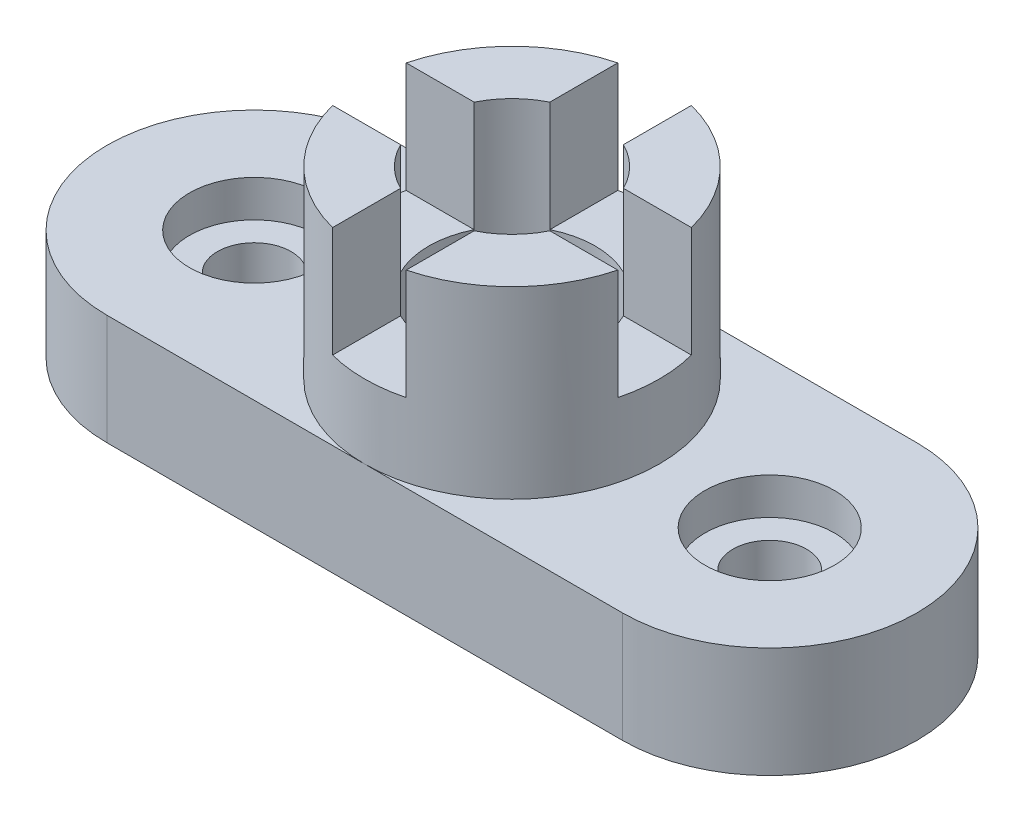
ISO-10303-21;
HEADER;
FILE_DESCRIPTION(('STEP AP214'),'2;1');
FILE_NAME('part.step','',(''),(''),'','','');
FILE_SCHEMA(('AUTOMOTIVE_DESIGN { 1 0 10303 214 1 1 1 1 }'));
ENDSEC;
DATA;
#1=APPLICATION_CONTEXT('core data for automotive mechanical design processes');
#2=APPLICATION_PROTOCOL_DEFINITION('international standard','automotive_design',2000,#1);
#3=PRODUCT_CONTEXT('',#1,'mechanical');
#4=PRODUCT('Part','Part','',(#3));
#5=PRODUCT_RELATED_PRODUCT_CATEGORY('part','',(#4));
#6=PRODUCT_DEFINITION_FORMATION('','',#4);
#7=PRODUCT_DEFINITION_CONTEXT('part definition',#1,'design');
#8=PRODUCT_DEFINITION('design','',#6,#7);
#9=PRODUCT_DEFINITION_SHAPE('','',#8);
#10=(LENGTH_UNIT() NAMED_UNIT(*) SI_UNIT(.MILLI.,.METRE.));
#11=(NAMED_UNIT(*) PLANE_ANGLE_UNIT() SI_UNIT($,.RADIAN.));
#12=(NAMED_UNIT(*) SI_UNIT($,.STERADIAN.) SOLID_ANGLE_UNIT());
#13=UNCERTAINTY_MEASURE_WITH_UNIT(LENGTH_MEASURE(1.E-05),#10,'distance_accuracy_value','');
#14=(GEOMETRIC_REPRESENTATION_CONTEXT(3) GLOBAL_UNCERTAINTY_ASSIGNED_CONTEXT((#13)) GLOBAL_UNIT_ASSIGNED_CONTEXT((#10,
#11,#12)) REPRESENTATION_CONTEXT('',''));
#15=CARTESIAN_POINT('',(0.,0.,0.));
#16=DIRECTION('',(0.,0.,1.));
#17=DIRECTION('',(1.,0.,0.));
#18=AXIS2_PLACEMENT_3D('',#15,#16,#17);
#19=CARTESIAN_POINT('',(0.,19.05,25.4));
#20=DIRECTION('',(0.,0.,-1.));
#21=DIRECTION('',(-1.,0.,0.));
#22=AXIS2_PLACEMENT_3D('',#19,#20,#21);
#23=PLANE('',#22);
#24=DIRECTION('',(1.,0.,0.));
#25=VECTOR('',#24,1.);
#26=CARTESIAN_POINT('',(0.,0.,25.4));
#27=LINE('',#26,#25);
#28=CARTESIAN_POINT('',(-63.0210482498654,0.,25.4));
#29=VERTEX_POINT('',#28);
#30=CARTESIAN_POINT('',(25.8789517501346,0.,25.4));
#31=VERTEX_POINT('',#30);
#32=EDGE_CURVE('E355',#29,#31,#27,.T.);
#33=ORIENTED_EDGE('',*,*,#32,.T.);
#34=DIRECTION('',(0.,-1.,0.));
#35=VECTOR('',#34,1.);
#36=CARTESIAN_POINT('',(25.8789517501346,19.05,25.4));
#37=LINE('',#36,#35);
#38=CARTESIAN_POINT('',(25.8789517501346,19.05,25.4));
#39=VERTEX_POINT('',#38);
#40=EDGE_CURVE('E286',#39,#31,#37,.T.);
#41=ORIENTED_EDGE('',*,*,#40,.F.);
#42=DIRECTION('',(1.,0.,0.));
#43=VECTOR('',#42,1.);
#44=CARTESIAN_POINT('',(0.,19.05,25.4));
#45=LINE('',#44,#43);
#46=CARTESIAN_POINT('',(-18.5710482498654,19.05,25.4));
#47=VERTEX_POINT('',#46);
#48=EDGE_CURVE('E273',#47,#39,#45,.T.);
#49=ORIENTED_EDGE('',*,*,#48,.F.);
#50=DIRECTION('',(1.,0.,0.));
#51=VECTOR('',#50,1.);
#52=CARTESIAN_POINT('',(0.,19.05,25.4));
#53=LINE('',#52,#51);
#54=CARTESIAN_POINT('',(-63.0210482498654,19.05,25.4));
#55=VERTEX_POINT('',#54);
#56=EDGE_CURVE('E356',#55,#47,#53,.T.);
#57=ORIENTED_EDGE('',*,*,#56,.F.);
#58=DIRECTION('',(0.,-1.,0.));
#59=VECTOR('',#58,1.);
#60=CARTESIAN_POINT('',(-63.0210482498654,19.05,25.4));
#61=LINE('',#60,#59);
#62=EDGE_CURVE('E368',#55,#29,#61,.T.);
#63=ORIENTED_EDGE('',*,*,#62,.T.);
#64=EDGE_LOOP('',(#33,#41,#49,#57,#63));
#65=FACE_BOUND('',#64,.T.);
#66=ADVANCED_FACE('F61',(#65),#23,.F.);
#67=CARTESIAN_POINT('',(0.,19.05,-25.4));
#68=DIRECTION('',(0.,0.,-1.));
#69=DIRECTION('',(-1.,0.,0.));
#70=AXIS2_PLACEMENT_3D('',#67,#68,#69);
#71=PLANE('',#70);
#72=DIRECTION('',(1.,0.,0.));
#73=VECTOR('',#72,1.);
#74=CARTESIAN_POINT('',(0.,0.,-25.4));
#75=LINE('',#74,#73);
#76=CARTESIAN_POINT('',(-63.0210482498654,0.,-25.4));
#77=VERTEX_POINT('',#76);
#78=CARTESIAN_POINT('',(25.8789517501346,0.,-25.4));
#79=VERTEX_POINT('',#78);
#80=EDGE_CURVE('E370',#77,#79,#75,.T.);
#81=ORIENTED_EDGE('',*,*,#80,.F.);
#82=DIRECTION('',(0.,-1.,0.));
#83=VECTOR('',#82,1.);
#84=CARTESIAN_POINT('',(-63.0210482498654,19.05,-25.4));
#85=LINE('',#84,#83);
#86=CARTESIAN_POINT('',(-63.0210482498654,19.05,-25.4));
#87=VERTEX_POINT('',#86);
#88=EDGE_CURVE('E87',#87,#77,#85,.T.);
#89=ORIENTED_EDGE('',*,*,#88,.F.);
#90=DIRECTION('',(1.,0.,0.));
#91=VECTOR('',#90,1.);
#92=CARTESIAN_POINT('',(0.,19.05,-25.4));
#93=LINE('',#92,#91);
#94=CARTESIAN_POINT('',(-18.5710482498654,19.05,-25.4));
#95=VERTEX_POINT('',#94);
#96=EDGE_CURVE('E361',#87,#95,#93,.T.);
#97=ORIENTED_EDGE('',*,*,#96,.T.);
#98=DIRECTION('',(1.,0.,0.));
#99=VECTOR('',#98,1.);
#100=CARTESIAN_POINT('',(0.,19.05,-25.4));
#101=LINE('',#100,#99);
#102=CARTESIAN_POINT('',(25.8789517501346,19.05,-25.4));
#103=VERTEX_POINT('',#102);
#104=EDGE_CURVE('E278',#95,#103,#101,.T.);
#105=ORIENTED_EDGE('',*,*,#104,.T.);
#106=DIRECTION('',(0.,-1.,0.));
#107=VECTOR('',#106,1.);
#108=CARTESIAN_POINT('',(25.8789517501346,19.05,-25.4));
#109=LINE('',#108,#107);
#110=EDGE_CURVE('E281',#103,#79,#109,.T.);
#111=ORIENTED_EDGE('',*,*,#110,.T.);
#112=EDGE_LOOP('',(#81,#89,#97,#105,#111));
#113=FACE_BOUND('',#112,.T.);
#114=ADVANCED_FACE('F405',(#113),#71,.T.);
#115=CARTESIAN_POINT('',(-63.0210482498654,19.05,0.));
#116=DIRECTION('',(0.,-1.,0.));
#117=DIRECTION('',(0.,0.,-1.));
#118=AXIS2_PLACEMENT_3D('',#115,#116,#117);
#119=CYLINDRICAL_SURFACE('',#118,25.4);
#120=CARTESIAN_POINT('',(-63.0210482498654,0.,0.));
#121=DIRECTION('',(0.,1.,0.));
#122=DIRECTION('',(0.,0.,1.));
#123=AXIS2_PLACEMENT_3D('',#120,#121,#122);
#124=CIRCLE('',#123,25.4);
#125=EDGE_CURVE('E359',#77,#29,#124,.T.);
#126=ORIENTED_EDGE('',*,*,#125,.T.);
#127=ORIENTED_EDGE('',*,*,#62,.F.);
#128=CARTESIAN_POINT('',(-63.0210482498654,19.05,0.));
#129=DIRECTION('',(0.,1.,0.));
#130=DIRECTION('',(0.,0.,1.));
#131=AXIS2_PLACEMENT_3D('',#128,#129,#130);
#132=CIRCLE('',#131,25.4);
#133=EDGE_CURVE('E77',#87,#55,#132,.T.);
#134=ORIENTED_EDGE('',*,*,#133,.F.);
#135=ORIENTED_EDGE('',*,*,#88,.T.);
#136=EDGE_LOOP('',(#126,#127,#134,#135));
#137=FACE_BOUND('',#136,.T.);
#138=ADVANCED_FACE('F406',(#137),#119,.T.);
#139=CARTESIAN_POINT('',(-63.0210482498654,19.05,0.));
#140=DIRECTION('',(0.,-1.,0.));
#141=DIRECTION('',(0.,0.,-1.));
#142=AXIS2_PLACEMENT_3D('',#139,#140,#141);
#143=CYLINDRICAL_SURFACE('',#142,11.176);
#144=CARTESIAN_POINT('',(-63.0210482498654,12.7,0.));
#145=DIRECTION('',(0.,1.,0.));
#146=DIRECTION('',(0.,0.,1.));
#147=AXIS2_PLACEMENT_3D('',#144,#145,#146);
#148=CIRCLE('',#147,11.176);
#149=CARTESIAN_POINT('',(-63.0210482498654,12.7,-11.176));
#150=VERTEX_POINT('',#149);
#151=EDGE_CURVE('E12',#150,#150,#148,.T.);
#152=CARTESIAN_POINT('',(-63.0210482498654,19.05,0.));
#153=DIRECTION('',(0.,1.,0.));
#154=DIRECTION('',(0.,0.,1.));
#155=AXIS2_PLACEMENT_3D('',#152,#153,#154);
#156=CIRCLE('',#155,11.176);
#157=CARTESIAN_POINT('',(-63.0210482498654,19.05,-11.176));
#158=VERTEX_POINT('',#157);
#159=EDGE_CURVE('E365',#158,#158,#156,.T.);
#160=CARTESIAN_POINT('',(-63.0210482498654,12.7,-11.176));
#161=CARTESIAN_POINT('',(-63.0210482498654,12.7661458333333,-11.176));
#162=CARTESIAN_POINT('',(-63.0210482498654,12.8322916666667,-11.176));
#163=CARTESIAN_POINT('',(-63.0210482498654,12.9645833333333,-11.176));
#164=CARTESIAN_POINT('',(-63.0210482498654,13.0307291666667,-11.176));
#165=CARTESIAN_POINT('',(-63.0210482498654,13.1630208333333,-11.176));
#166=CARTESIAN_POINT('',(-63.0210482498654,13.2291666666667,-11.176));
#167=CARTESIAN_POINT('',(-63.0210482498654,13.3614583333333,-11.176));
#168=CARTESIAN_POINT('',(-63.0210482498654,13.4276041666667,-11.176));
#169=CARTESIAN_POINT('',(-63.0210482498654,13.5598958333333,-11.176));
#170=CARTESIAN_POINT('',(-63.0210482498654,13.6260416666667,-11.176));
#171=CARTESIAN_POINT('',(-63.0210482498654,13.7583333333333,-11.176));
#172=CARTESIAN_POINT('',(-63.0210482498654,13.8244791666667,-11.176));
#173=CARTESIAN_POINT('',(-63.0210482498654,13.9567708333333,-11.176));
#174=CARTESIAN_POINT('',(-63.0210482498654,14.0229166666667,-11.176));
#175=CARTESIAN_POINT('',(-63.0210482498654,14.1552083333333,-11.176));
#176=CARTESIAN_POINT('',(-63.0210482498654,14.2213541666667,-11.176));
#177=CARTESIAN_POINT('',(-63.0210482498654,14.3536458333333,-11.176));
#178=CARTESIAN_POINT('',(-63.0210482498654,14.4197916666667,-11.176));
#179=CARTESIAN_POINT('',(-63.0210482498654,14.5520833333333,-11.176));
#180=CARTESIAN_POINT('',(-63.0210482498654,14.6182291666667,-11.176));
#181=CARTESIAN_POINT('',(-63.0210482498654,14.7505208333333,-11.176));
#182=CARTESIAN_POINT('',(-63.0210482498654,14.8166666666667,-11.176));
#183=CARTESIAN_POINT('',(-63.0210482498654,14.9489583333333,-11.176));
#184=CARTESIAN_POINT('',(-63.0210482498654,15.0151041666667,-11.176));
#185=CARTESIAN_POINT('',(-63.0210482498654,15.1473958333333,-11.176));
#186=CARTESIAN_POINT('',(-63.0210482498654,15.2135416666667,-11.176));
#187=CARTESIAN_POINT('',(-63.0210482498654,15.3458333333333,-11.176));
#188=CARTESIAN_POINT('',(-63.0210482498654,15.4119791666667,-11.176));
#189=CARTESIAN_POINT('',(-63.0210482498654,15.5442708333333,-11.176));
#190=CARTESIAN_POINT('',(-63.0210482498654,15.6104166666667,-11.176));
#191=CARTESIAN_POINT('',(-63.0210482498654,15.7427083333333,-11.176));
#192=CARTESIAN_POINT('',(-63.0210482498654,15.8088541666667,-11.176));
#193=CARTESIAN_POINT('',(-63.0210482498654,15.9411458333333,-11.176));
#194=CARTESIAN_POINT('',(-63.0210482498654,16.0072916666667,-11.176));
#195=CARTESIAN_POINT('',(-63.0210482498654,16.1395833333333,-11.176));
#196=CARTESIAN_POINT('',(-63.0210482498654,16.2057291666667,-11.176));
#197=CARTESIAN_POINT('',(-63.0210482498654,16.3380208333333,-11.176));
#198=CARTESIAN_POINT('',(-63.0210482498654,16.4041666666667,-11.176));
#199=CARTESIAN_POINT('',(-63.0210482498654,16.5364583333333,-11.176));
#200=CARTESIAN_POINT('',(-63.0210482498654,16.6026041666667,-11.176));
#201=CARTESIAN_POINT('',(-63.0210482498654,16.7348958333333,-11.176));
#202=CARTESIAN_POINT('',(-63.0210482498654,16.8010416666667,-11.176));
#203=CARTESIAN_POINT('',(-63.0210482498654,16.9333333333333,-11.176));
#204=CARTESIAN_POINT('',(-63.0210482498654,16.9994791666667,-11.176));
#205=CARTESIAN_POINT('',(-63.0210482498654,17.1317708333333,-11.176));
#206=CARTESIAN_POINT('',(-63.0210482498654,17.1979166666667,-11.176));
#207=CARTESIAN_POINT('',(-63.0210482498654,17.3302083333333,-11.176));
#208=CARTESIAN_POINT('',(-63.0210482498654,17.3963541666667,-11.176));
#209=CARTESIAN_POINT('',(-63.0210482498654,17.5286458333333,-11.176));
#210=CARTESIAN_POINT('',(-63.0210482498654,17.5947916666667,-11.176));
#211=CARTESIAN_POINT('',(-63.0210482498654,17.7270833333333,-11.176));
#212=CARTESIAN_POINT('',(-63.0210482498654,17.7932291666667,-11.176));
#213=CARTESIAN_POINT('',(-63.0210482498654,17.9255208333333,-11.176));
#214=CARTESIAN_POINT('',(-63.0210482498654,17.9916666666667,-11.176));
#215=CARTESIAN_POINT('',(-63.0210482498654,18.1239583333333,-11.176));
#216=CARTESIAN_POINT('',(-63.0210482498654,18.1901041666667,-11.176));
#217=CARTESIAN_POINT('',(-63.0210482498654,18.3223958333333,-11.176));
#218=CARTESIAN_POINT('',(-63.0210482498654,18.3885416666667,-11.176));
#219=CARTESIAN_POINT('',(-63.0210482498654,18.5208333333333,-11.176));
#220=CARTESIAN_POINT('',(-63.0210482498654,18.5869791666667,-11.176));
#221=CARTESIAN_POINT('',(-63.0210482498654,18.7192708333333,-11.176));
#222=CARTESIAN_POINT('',(-63.0210482498654,18.7854166666667,-11.176));
#223=CARTESIAN_POINT('',(-63.0210482498654,18.9177083333333,-11.176));
#224=CARTESIAN_POINT('',(-63.0210482498654,18.9838541666667,-11.176));
#225=CARTESIAN_POINT('',(-63.0210482498654,19.05,-11.176));
#226=B_SPLINE_CURVE_WITH_KNOTS('',3,(#160,#161,#162,#163,#164,#165,#166,#167,#168,#169,#170,
#171,#172,#173,#174,#175,#176,#177,#178,#179,#180,#181,#182,#183,#184,#185,#186,#187,#188,#189,
#190,#191,#192,#193,#194,#195,#196,#197,#198,#199,#200,#201,#202,#203,#204,#205,#206,#207,#208,
#209,#210,#211,#212,#213,#214,#215,#216,#217,#218,#219,#220,#221,#222,#223,#224,#225),
.UNSPECIFIED.,.F.,.F.,(4,2,2,2,2,2,2,2,2,2,2,2,2,2,2,2,2,2,2,2,2,2,2,2,2,2,2,2,2,2,2,2,4),(0.,
0.198437499999999,0.396874999999998,0.5953125,0.793749999999999,0.992187499999998,1.190625,
1.3890625,1.5875,1.7859375,1.984375,2.1828125,2.38125,2.5796875,2.778125,2.9765625,3.175,
3.3734375,3.571875,3.7703125,3.96875,4.1671875,4.365625,4.5640625,4.7625,4.9609375,5.159375,
5.3578125,5.55625,5.7546875,5.953125,6.1515625,6.35),.UNSPECIFIED.);
#227=EDGE_CURVE('BSEAM514',#150,#158,#226,.T.);
#228=ORIENTED_EDGE('',*,*,#151,.F.);
#229=ORIENTED_EDGE('',*,*,#159,.T.);
#230=ORIENTED_EDGE('',*,*,#227,.T.);
#231=ORIENTED_EDGE('',*,*,#227,.F.);
#232=EDGE_LOOP('',(#228,#230,#229,#231));
#233=FACE_BOUND('',#232,.T.);
#234=ADVANCED_FACE('F514',(#233),#143,.F.);
#235=CARTESIAN_POINT('',(0.,19.05,0.));
#236=DIRECTION('',(0.,1.,0.));
#237=DIRECTION('',(0.,0.,1.));
#238=AXIS2_PLACEMENT_3D('',#235,#236,#237);
#239=PLANE('',#238);
#240=ORIENTED_EDGE('',*,*,#56,.T.);
#241=CARTESIAN_POINT('',(-18.5710482498654,19.05,0.));
#242=DIRECTION('',(0.,1.,0.));
#243=DIRECTION('',(0.,0.,1.));
#244=AXIS2_PLACEMENT_3D('',#241,#242,#243);
#245=CIRCLE('',#244,25.4);
#246=EDGE_CURVE('E358',#95,#47,#245,.T.);
#247=ORIENTED_EDGE('',*,*,#246,.F.);
#248=ORIENTED_EDGE('',*,*,#96,.F.);
#249=ORIENTED_EDGE('',*,*,#133,.T.);
#250=EDGE_LOOP('',(#240,#247,#248,#249));
#251=FACE_BOUND('',#250,.T.);
#252=ORIENTED_EDGE('',*,*,#159,.F.);
#253=EDGE_LOOP('',(#252));
#254=FACE_BOUND('',#253,.T.);
#255=ADVANCED_FACE('F400',(#251,#254),#239,.T.);
#256=CARTESIAN_POINT('',(0.,0.,0.));
#257=DIRECTION('',(0.,1.,0.));
#258=DIRECTION('',(0.,0.,1.));
#259=AXIS2_PLACEMENT_3D('',#256,#257,#258);
#260=PLANE('',#259);
#261=CARTESIAN_POINT('',(-18.5710482498654,0.,0.));
#262=DIRECTION('',(0.,1.,0.));
#263=DIRECTION('',(0.,0.,1.));
#264=AXIS2_PLACEMENT_3D('',#261,#262,#263);
#265=CIRCLE('',#264,14.351);
#266=CARTESIAN_POINT('',(-18.5710482498654,0.,14.351));
#267=VERTEX_POINT('',#266);
#268=EDGE_CURVE('E331',#267,#267,#265,.T.);
#269=ORIENTED_EDGE('',*,*,#268,.T.);
#270=EDGE_LOOP('',(#269));
#271=FACE_BOUND('',#270,.T.);
#272=ORIENTED_EDGE('',*,*,#80,.T.);
#273=CARTESIAN_POINT('',(25.8789517501346,0.,0.));
#274=DIRECTION('',(0.,1.,0.));
#275=DIRECTION('',(0.,0.,1.));
#276=AXIS2_PLACEMENT_3D('',#273,#274,#275);
#277=CIRCLE('',#276,25.4);
#278=EDGE_CURVE('E267',#31,#79,#277,.T.);
#279=ORIENTED_EDGE('',*,*,#278,.F.);
#280=ORIENTED_EDGE('',*,*,#32,.F.);
#281=ORIENTED_EDGE('',*,*,#125,.F.);
#282=EDGE_LOOP('',(#272,#279,#280,#281));
#283=FACE_BOUND('',#282,.T.);
#284=CARTESIAN_POINT('',(25.8789517501346,0.,0.));
#285=DIRECTION('',(0.,1.,0.));
#286=DIRECTION('',(0.,0.,1.));
#287=AXIS2_PLACEMENT_3D('',#284,#285,#286);
#288=CIRCLE('',#287,6.35);
#289=CARTESIAN_POINT('',(25.8789517501346,0.,6.35));
#290=VERTEX_POINT('',#289);
#291=EDGE_CURVE('E421',#290,#290,#288,.T.);
#292=ORIENTED_EDGE('',*,*,#291,.T.);
#293=EDGE_LOOP('',(#292));
#294=FACE_BOUND('',#293,.T.);
#295=CARTESIAN_POINT('',(-63.0210482498654,0.,0.));
#296=DIRECTION('',(0.,1.,0.));
#297=DIRECTION('',(0.,0.,1.));
#298=AXIS2_PLACEMENT_3D('',#295,#296,#297);
#299=CIRCLE('',#298,6.35);
#300=CARTESIAN_POINT('',(-63.0210482498654,0.,6.35));
#301=VERTEX_POINT('',#300);
#302=EDGE_CURVE('E424',#301,#301,#299,.T.);
#303=ORIENTED_EDGE('',*,*,#302,.T.);
#304=EDGE_LOOP('',(#303));
#305=FACE_BOUND('',#304,.T.);
#306=ADVANCED_FACE('F413',(#271,#283,#294,#305),#260,.F.);
#307=CARTESIAN_POINT('',(-18.5710482498654,50.8,0.));
#308=DIRECTION('',(0.,-1.,0.));
#309=DIRECTION('',(0.,0.,-1.));
#310=AXIS2_PLACEMENT_3D('',#307,#308,#309);
#311=CYLINDRICAL_SURFACE('',#310,14.351);
#312=ORIENTED_EDGE('',*,*,#268,.F.);
#313=EDGE_LOOP('',(#312));
#314=FACE_BOUND('',#313,.T.);
#315=CARTESIAN_POINT('',(-18.5710482498654,31.75,0.));
#316=DIRECTION('',(0.,1.,0.));
#317=DIRECTION('',(0.,0.,1.));
#318=AXIS2_PLACEMENT_3D('',#315,#316,#317);
#319=CIRCLE('',#318,14.351);
#320=CARTESIAN_POINT('',(-5.70136678527582,31.75,6.34999999999999));
#321=VERTEX_POINT('',#320);
#322=CARTESIAN_POINT('',(-5.70136678527583,31.75,-6.35000000000001));
#323=VERTEX_POINT('',#322);
#324=EDGE_CURVE('E208',#321,#323,#319,.T.);
#325=ORIENTED_EDGE('',*,*,#324,.T.);
#326=DIRECTION('',(0.,-1.,0.));
#327=VECTOR('',#326,1.);
#328=CARTESIAN_POINT('',(-5.70136678527583,50.8,-6.35000000000001));
#329=LINE('',#328,#327);
#330=CARTESIAN_POINT('',(-5.70136678527583,50.8,-6.35000000000001));
#331=VERTEX_POINT('',#330);
#332=EDGE_CURVE('E265',#331,#323,#329,.T.);
#333=ORIENTED_EDGE('',*,*,#332,.F.);
#334=CARTESIAN_POINT('',(-18.5710482498654,50.8,0.));
#335=DIRECTION('',(0.,1.,0.));
#336=DIRECTION('',(0.,0.,1.));
#337=AXIS2_PLACEMENT_3D('',#334,#335,#336);
#338=CIRCLE('',#337,14.351);
#339=CARTESIAN_POINT('',(-12.2210482498654,50.8,-12.8696814645896));
#340=VERTEX_POINT('',#339);
#341=EDGE_CURVE('E247',#331,#340,#338,.T.);
#342=ORIENTED_EDGE('',*,*,#341,.T.);
#343=DIRECTION('',(0.,-1.,0.));
#344=VECTOR('',#343,1.);
#345=CARTESIAN_POINT('',(-12.2210482498654,50.8,-12.8696814645896));
#346=LINE('',#345,#344);
#347=CARTESIAN_POINT('',(-12.2210482498654,31.75,-12.8696814645896));
#348=VERTEX_POINT('',#347);
#349=EDGE_CURVE('E256',#340,#348,#346,.T.);
#350=ORIENTED_EDGE('',*,*,#349,.T.);
#351=CARTESIAN_POINT('',(-18.5710482498654,31.75,0.));
#352=DIRECTION('',(0.,1.,0.));
#353=DIRECTION('',(0.,0.,1.));
#354=AXIS2_PLACEMENT_3D('',#351,#352,#353);
#355=CIRCLE('',#354,14.351);
#356=CARTESIAN_POINT('',(-24.9210482498654,31.75,-12.8696814645896));
#357=VERTEX_POINT('',#356);
#358=EDGE_CURVE('E298',#348,#357,#355,.T.);
#359=ORIENTED_EDGE('',*,*,#358,.T.);
#360=DIRECTION('',(0.,-1.,0.));
#361=VECTOR('',#360,1.);
#362=CARTESIAN_POINT('',(-24.9210482498654,50.8,-12.8696814645896));
#363=LINE('',#362,#361);
#364=CARTESIAN_POINT('',(-24.9210482498654,50.8,-12.8696814645896));
#365=VERTEX_POINT('',#364);
#366=EDGE_CURVE('E352',#365,#357,#363,.T.);
#367=ORIENTED_EDGE('',*,*,#366,.F.);
#368=CARTESIAN_POINT('',(-18.5710482498654,50.8,0.));
#369=DIRECTION('',(0.,1.,0.));
#370=DIRECTION('',(0.,0.,1.));
#371=AXIS2_PLACEMENT_3D('',#368,#369,#370);
#372=CIRCLE('',#371,14.351);
#373=CARTESIAN_POINT('',(-31.4407297144549,50.8,-6.35));
#374=VERTEX_POINT('',#373);
#375=EDGE_CURVE('E332',#365,#374,#372,.T.);
#376=ORIENTED_EDGE('',*,*,#375,.T.);
#377=DIRECTION('',(0.,-1.,0.));
#378=VECTOR('',#377,1.);
#379=CARTESIAN_POINT('',(-31.4407297144549,50.8,-6.35));
#380=LINE('',#379,#378);
#381=CARTESIAN_POINT('',(-31.4407297144549,31.75,-6.35));
#382=VERTEX_POINT('',#381);
#383=EDGE_CURVE('E341',#374,#382,#380,.T.);
#384=ORIENTED_EDGE('',*,*,#383,.T.);
#385=CARTESIAN_POINT('',(-18.5710482498654,31.75,0.));
#386=DIRECTION('',(0.,1.,0.));
#387=DIRECTION('',(0.,0.,1.));
#388=AXIS2_PLACEMENT_3D('',#385,#386,#387);
#389=CIRCLE('',#388,14.351);
#390=CARTESIAN_POINT('',(-31.4407297144549,31.75,6.35));
#391=VERTEX_POINT('',#390);
#392=EDGE_CURVE('E440',#382,#391,#389,.T.);
#393=ORIENTED_EDGE('',*,*,#392,.T.);
#394=DIRECTION('',(0.,-1.,0.));
#395=VECTOR('',#394,1.);
#396=CARTESIAN_POINT('',(-31.4407297144549,50.8,6.35));
#397=LINE('',#396,#395);
#398=CARTESIAN_POINT('',(-31.4407297144549,50.8,6.35));
#399=VERTEX_POINT('',#398);
#400=EDGE_CURVE('E328',#399,#391,#397,.T.);
#401=ORIENTED_EDGE('',*,*,#400,.F.);
#402=CARTESIAN_POINT('',(-18.5710482498654,50.8,0.));
#403=DIRECTION('',(0.,1.,0.));
#404=DIRECTION('',(0.,0.,1.));
#405=AXIS2_PLACEMENT_3D('',#402,#403,#404);
#406=CIRCLE('',#405,14.351);
#407=CARTESIAN_POINT('',(-24.9210482498654,50.8,12.8696814645896));
#408=VERTEX_POINT('',#407);
#409=EDGE_CURVE('E308',#399,#408,#406,.T.);
#410=ORIENTED_EDGE('',*,*,#409,.T.);
#411=DIRECTION('',(0.,-1.,0.));
#412=VECTOR('',#411,1.);
#413=CARTESIAN_POINT('',(-24.9210482498654,50.8,12.8696814645896));
#414=LINE('',#413,#412);
#415=CARTESIAN_POINT('',(-24.9210482498654,31.75,12.8696814645896));
#416=VERTEX_POINT('',#415);
#417=EDGE_CURVE('E319',#408,#416,#414,.T.);
#418=ORIENTED_EDGE('',*,*,#417,.T.);
#419=CARTESIAN_POINT('',(-18.5710482498654,31.75,0.));
#420=DIRECTION('',(0.,1.,0.));
#421=DIRECTION('',(0.,0.,1.));
#422=AXIS2_PLACEMENT_3D('',#419,#420,#421);
#423=CIRCLE('',#422,14.351);
#424=CARTESIAN_POINT('',(-12.2210482498654,31.75,12.8696814645896));
#425=VERTEX_POINT('',#424);
#426=EDGE_CURVE('E289',#416,#425,#423,.T.);
#427=ORIENTED_EDGE('',*,*,#426,.T.);
#428=DIRECTION('',(0.,-1.,0.));
#429=VECTOR('',#428,1.);
#430=CARTESIAN_POINT('',(-12.2210482498654,50.8,12.8696814645896));
#431=LINE('',#430,#429);
#432=CARTESIAN_POINT('',(-12.2210482498654,50.8,12.8696814645896));
#433=VERTEX_POINT('',#432);
#434=EDGE_CURVE('E244',#433,#425,#431,.T.);
#435=ORIENTED_EDGE('',*,*,#434,.F.);
#436=CARTESIAN_POINT('',(-18.5710482498654,50.8,0.));
#437=DIRECTION('',(0.,1.,0.));
#438=DIRECTION('',(0.,0.,1.));
#439=AXIS2_PLACEMENT_3D('',#436,#437,#438);
#440=CIRCLE('',#439,14.351);
#441=CARTESIAN_POINT('',(-5.70136678527582,50.8,6.34999999999999));
#442=VERTEX_POINT('',#441);
#443=EDGE_CURVE('E232',#433,#442,#440,.T.);
#444=ORIENTED_EDGE('',*,*,#443,.T.);
#445=DIRECTION('',(0.,-1.,0.));
#446=VECTOR('',#445,1.);
#447=CARTESIAN_POINT('',(-5.70136678527582,50.8,6.34999999999999));
#448=LINE('',#447,#446);
#449=EDGE_CURVE('E224',#442,#321,#448,.T.);
#450=ORIENTED_EDGE('',*,*,#449,.T.);
#451=EDGE_LOOP('',(#325,#333,#342,#350,#359,#367,#376,#384,#393,#401,#410,#418,#427,#435,#444,#450));
#452=FACE_BOUND('',#451,.T.);
#453=ADVANCED_FACE('F230',(#314,#452),#311,.F.);
#454=CARTESIAN_POINT('',(-24.9210482498654,50.8,0.));
#455=DIRECTION('',(1.,0.,0.));
#456=DIRECTION('',(0.,0.,-1.));
#457=AXIS2_PLACEMENT_3D('',#454,#455,#456);
#458=PLANE('',#457);
#459=DIRECTION('',(0.,0.,1.));
#460=VECTOR('',#459,1.);
#461=CARTESIAN_POINT('',(-24.9210482498654,31.75,0.));
#462=LINE('',#461,#460);
#463=CARTESIAN_POINT('',(-24.9210482498654,31.75,-24.5934442484171));
#464=VERTEX_POINT('',#463);
#465=EDGE_CURVE('E306',#464,#357,#462,.T.);
#466=ORIENTED_EDGE('',*,*,#465,.F.);
#467=DIRECTION('',(0.,-1.,0.));
#468=VECTOR('',#467,1.);
#469=CARTESIAN_POINT('',(-24.9210482498654,50.8,-24.5934442484171));
#470=LINE('',#469,#468);
#471=CARTESIAN_POINT('',(-24.9210482498654,50.8,-24.5934442484171));
#472=VERTEX_POINT('',#471);
#473=EDGE_CURVE('E349',#472,#464,#470,.T.);
#474=ORIENTED_EDGE('',*,*,#473,.F.);
#475=DIRECTION('',(0.,0.,1.));
#476=VECTOR('',#475,1.);
#477=CARTESIAN_POINT('',(-24.9210482498654,50.8,0.));
#478=LINE('',#477,#476);
#479=EDGE_CURVE('E335',#472,#365,#478,.T.);
#480=ORIENTED_EDGE('',*,*,#479,.T.);
#481=ORIENTED_EDGE('',*,*,#366,.T.);
#482=EDGE_LOOP('',(#466,#474,#480,#481));
#483=FACE_BOUND('',#482,.T.);
#484=ADVANCED_FACE('F470',(#483),#458,.T.);
#485=CARTESIAN_POINT('',(-18.5710482498654,50.8,0.));
#486=DIRECTION('',(0.,-1.,0.));
#487=DIRECTION('',(0.,0.,-1.));
#488=AXIS2_PLACEMENT_3D('',#485,#486,#487);
#489=CYLINDRICAL_SURFACE('',#488,25.4);
#490=CARTESIAN_POINT('',(-18.5710482498654,19.05,0.));
#491=DIRECTION('',(0.,1.,0.));
#492=DIRECTION('',(0.,0.,1.));
#493=AXIS2_PLACEMENT_3D('',#490,#491,#492);
#494=CIRCLE('',#493,25.4);
#495=EDGE_CURVE('E271',#47,#95,#494,.T.);
#496=ORIENTED_EDGE('',*,*,#495,.T.);
#497=ORIENTED_EDGE('',*,*,#246,.T.);
#498=EDGE_LOOP('',(#496,#497));
#499=FACE_BOUND('',#498,.T.);
#500=CARTESIAN_POINT('',(-18.5710482498654,31.75,0.));
#501=DIRECTION('',(0.,1.,0.));
#502=DIRECTION('',(0.,0.,1.));
#503=AXIS2_PLACEMENT_3D('',#500,#501,#502);
#504=CIRCLE('',#503,25.4);
#505=CARTESIAN_POINT('',(-12.2210482498654,31.75,-24.5934442484171));
#506=VERTEX_POINT('',#505);
#507=EDGE_CURVE('E304',#506,#464,#504,.T.);
#508=ORIENTED_EDGE('',*,*,#507,.F.);
#509=DIRECTION('',(0.,-1.,0.));
#510=VECTOR('',#509,1.);
#511=CARTESIAN_POINT('',(-12.2210482498654,50.8,-24.5934442484171));
#512=LINE('',#511,#510);
#513=CARTESIAN_POINT('',(-12.2210482498654,50.8,-24.5934442484171));
#514=VERTEX_POINT('',#513);
#515=EDGE_CURVE('E259',#514,#506,#512,.T.);
#516=ORIENTED_EDGE('',*,*,#515,.F.);
#517=CARTESIAN_POINT('',(-18.5710482498654,50.8,0.));
#518=DIRECTION('',(0.,1.,0.));
#519=DIRECTION('',(0.,0.,1.));
#520=AXIS2_PLACEMENT_3D('',#517,#518,#519);
#521=CIRCLE('',#520,25.4);
#522=CARTESIAN_POINT('',(6.02239599855171,50.8,-6.35000000000001));
#523=VERTEX_POINT('',#522);
#524=EDGE_CURVE('E252',#523,#514,#521,.T.);
#525=ORIENTED_EDGE('',*,*,#524,.F.);
#526=DIRECTION('',(0.,-1.,0.));
#527=VECTOR('',#526,1.);
#528=CARTESIAN_POINT('',(6.02239599855171,50.8,-6.35000000000001));
#529=LINE('',#528,#527);
#530=CARTESIAN_POINT('',(6.02239599855171,31.75,-6.35000000000001));
#531=VERTEX_POINT('',#530);
#532=EDGE_CURVE('E262',#523,#531,#529,.T.);
#533=ORIENTED_EDGE('',*,*,#532,.T.);
#534=CARTESIAN_POINT('',(-18.5710482498654,31.75,0.));
#535=DIRECTION('',(0.,1.,0.));
#536=DIRECTION('',(0.,0.,1.));
#537=AXIS2_PLACEMENT_3D('',#534,#535,#536);
#538=CIRCLE('',#537,25.4);
#539=CARTESIAN_POINT('',(6.02239599855171,31.75,6.34999999999999));
#540=VERTEX_POINT('',#539);
#541=EDGE_CURVE('E228',#540,#531,#538,.T.);
#542=ORIENTED_EDGE('',*,*,#541,.F.);
#543=DIRECTION('',(0.,-1.,0.));
#544=VECTOR('',#543,1.);
#545=CARTESIAN_POINT('',(6.02239599855171,50.8,6.34999999999999));
#546=LINE('',#545,#544);
#547=CARTESIAN_POINT('',(6.02239599855171,50.8,6.34999999999999));
#548=VERTEX_POINT('',#547);
#549=EDGE_CURVE('E227',#548,#540,#546,.T.);
#550=ORIENTED_EDGE('',*,*,#549,.F.);
#551=CARTESIAN_POINT('',(-18.5710482498654,50.8,0.));
#552=DIRECTION('',(0.,1.,0.));
#553=DIRECTION('',(0.,0.,1.));
#554=AXIS2_PLACEMENT_3D('',#551,#552,#553);
#555=CIRCLE('',#554,25.4);
#556=CARTESIAN_POINT('',(-12.2210482498654,50.8,24.5934442484171));
#557=VERTEX_POINT('',#556);
#558=EDGE_CURVE('E238',#557,#548,#555,.T.);
#559=ORIENTED_EDGE('',*,*,#558,.F.);
#560=DIRECTION('',(0.,-1.,0.));
#561=VECTOR('',#560,1.);
#562=CARTESIAN_POINT('',(-12.2210482498654,50.8,24.5934442484171));
#563=LINE('',#562,#561);
#564=CARTESIAN_POINT('',(-12.2210482498654,31.75,24.5934442484171));
#565=VERTEX_POINT('',#564);
#566=EDGE_CURVE('E236',#557,#565,#563,.T.);
#567=ORIENTED_EDGE('',*,*,#566,.T.);
#568=CARTESIAN_POINT('',(-18.5710482498654,31.75,0.));
#569=DIRECTION('',(0.,1.,0.));
#570=DIRECTION('',(0.,0.,1.));
#571=AXIS2_PLACEMENT_3D('',#568,#569,#570);
#572=CIRCLE('',#571,25.4);
#573=CARTESIAN_POINT('',(-24.9210482498654,31.75,24.5934442484171));
#574=VERTEX_POINT('',#573);
#575=EDGE_CURVE('E293',#574,#565,#572,.T.);
#576=ORIENTED_EDGE('',*,*,#575,.F.);
#577=DIRECTION('',(0.,-1.,0.));
#578=VECTOR('',#577,1.);
#579=CARTESIAN_POINT('',(-24.9210482498654,50.8,24.5934442484171));
#580=LINE('',#579,#578);
#581=CARTESIAN_POINT('',(-24.9210482498654,50.8,24.5934442484171));
#582=VERTEX_POINT('',#581);
#583=EDGE_CURVE('E322',#582,#574,#580,.T.);
#584=ORIENTED_EDGE('',*,*,#583,.F.);
#585=CARTESIAN_POINT('',(-18.5710482498654,50.8,0.));
#586=DIRECTION('',(0.,1.,0.));
#587=DIRECTION('',(0.,0.,1.));
#588=AXIS2_PLACEMENT_3D('',#585,#586,#587);
#589=CIRCLE('',#588,25.4);
#590=CARTESIAN_POINT('',(-43.1644924982825,50.8,6.35));
#591=VERTEX_POINT('',#590);
#592=EDGE_CURVE('E314',#591,#582,#589,.T.);
#593=ORIENTED_EDGE('',*,*,#592,.F.);
#594=DIRECTION('',(0.,-1.,0.));
#595=VECTOR('',#594,1.);
#596=CARTESIAN_POINT('',(-43.1644924982825,50.8,6.35));
#597=LINE('',#596,#595);
#598=CARTESIAN_POINT('',(-43.1644924982825,31.75,6.35));
#599=VERTEX_POINT('',#598);
#600=EDGE_CURVE('E325',#591,#599,#597,.T.);
#601=ORIENTED_EDGE('',*,*,#600,.T.);
#602=CARTESIAN_POINT('',(-18.5710482498654,31.75,0.));
#603=DIRECTION('',(0.,1.,0.));
#604=DIRECTION('',(0.,0.,1.));
#605=AXIS2_PLACEMENT_3D('',#602,#603,#604);
#606=CIRCLE('',#605,25.4);
#607=CARTESIAN_POINT('',(-43.1644924982825,31.75,-6.35));
#608=VERTEX_POINT('',#607);
#609=EDGE_CURVE('E436',#608,#599,#606,.T.);
#610=ORIENTED_EDGE('',*,*,#609,.F.);
#611=DIRECTION('',(0.,-1.,0.));
#612=VECTOR('',#611,1.);
#613=CARTESIAN_POINT('',(-43.1644924982825,50.8,-6.35));
#614=LINE('',#613,#612);
#615=CARTESIAN_POINT('',(-43.1644924982825,50.8,-6.35));
#616=VERTEX_POINT('',#615);
#617=EDGE_CURVE('E346',#616,#608,#614,.T.);
#618=ORIENTED_EDGE('',*,*,#617,.F.);
#619=CARTESIAN_POINT('',(-18.5710482498654,50.8,0.));
#620=DIRECTION('',(0.,1.,0.));
#621=DIRECTION('',(0.,0.,1.));
#622=AXIS2_PLACEMENT_3D('',#619,#620,#621);
#623=CIRCLE('',#622,25.4);
#624=EDGE_CURVE('E338',#472,#616,#623,.T.);
#625=ORIENTED_EDGE('',*,*,#624,.F.);
#626=ORIENTED_EDGE('',*,*,#473,.T.);
#627=EDGE_LOOP('',(#508,#516,#525,#533,#542,#550,#559,#567,#576,#584,#593,#601,#610,#618,#625,#626));
#628=FACE_BOUND('',#627,.T.);
#629=ADVANCED_FACE('F398',(#499,#628),#489,.T.);
#630=CARTESIAN_POINT('',(0.,50.8,-6.35000000000001));
#631=DIRECTION('',(0.,0.,-1.));
#632=DIRECTION('',(-1.,0.,0.));
#633=AXIS2_PLACEMENT_3D('',#630,#631,#632);
#634=PLANE('',#633);
#635=ORIENTED_EDGE('',*,*,#617,.T.);
#636=DIRECTION('',(1.,0.,0.));
#637=VECTOR('',#636,1.);
#638=CARTESIAN_POINT('',(0.,31.75,-6.35000000000001));
#639=LINE('',#638,#637);
#640=EDGE_CURVE('E443',#608,#382,#639,.T.);
#641=ORIENTED_EDGE('',*,*,#640,.T.);
#642=ORIENTED_EDGE('',*,*,#383,.F.);
#643=DIRECTION('',(1.,0.,0.));
#644=VECTOR('',#643,1.);
#645=CARTESIAN_POINT('',(0.,50.8,-6.35000000000001));
#646=LINE('',#645,#644);
#647=EDGE_CURVE('E95',#616,#374,#646,.T.);
#648=ORIENTED_EDGE('',*,*,#647,.F.);
#649=EDGE_LOOP('',(#635,#641,#642,#648));
#650=FACE_BOUND('',#649,.T.);
#651=ADVANCED_FACE('F476',(#650),#634,.F.);
#652=CARTESIAN_POINT('',(0.,50.8,0.));
#653=DIRECTION('',(0.,1.,0.));
#654=DIRECTION('',(0.,0.,1.));
#655=AXIS2_PLACEMENT_3D('',#652,#653,#654);
#656=PLANE('',#655);
#657=ORIENTED_EDGE('',*,*,#375,.F.);
#658=ORIENTED_EDGE('',*,*,#479,.F.);
#659=ORIENTED_EDGE('',*,*,#624,.T.);
#660=ORIENTED_EDGE('',*,*,#647,.T.);
#661=EDGE_LOOP('',(#657,#658,#659,#660));
#662=FACE_BOUND('',#661,.T.);
#663=ADVANCED_FACE('F473',(#662),#656,.T.);
#664=CARTESIAN_POINT('',(0.,50.8,6.34999999999999));
#665=DIRECTION('',(0.,0.,-1.));
#666=DIRECTION('',(-1.,0.,0.));
#667=AXIS2_PLACEMENT_3D('',#664,#665,#666);
#668=PLANE('',#667);
#669=DIRECTION('',(1.,0.,0.));
#670=VECTOR('',#669,1.);
#671=CARTESIAN_POINT('',(0.,31.75,6.34999999999999));
#672=LINE('',#671,#670);
#673=EDGE_CURVE('E438',#599,#391,#672,.T.);
#674=ORIENTED_EDGE('',*,*,#673,.F.);
#675=ORIENTED_EDGE('',*,*,#600,.F.);
#676=DIRECTION('',(1.,0.,0.));
#677=VECTOR('',#676,1.);
#678=CARTESIAN_POINT('',(0.,50.8,6.34999999999999));
#679=LINE('',#678,#677);
#680=EDGE_CURVE('E311',#591,#399,#679,.T.);
#681=ORIENTED_EDGE('',*,*,#680,.T.);
#682=ORIENTED_EDGE('',*,*,#400,.T.);
#683=EDGE_LOOP('',(#674,#675,#681,#682));
#684=FACE_BOUND('',#683,.T.);
#685=ADVANCED_FACE('F482',(#684),#668,.T.);
#686=CARTESIAN_POINT('',(-24.9210482498654,50.8,0.));
#687=DIRECTION('',(1.,0.,0.));
#688=DIRECTION('',(0.,0.,-1.));
#689=AXIS2_PLACEMENT_3D('',#686,#687,#688);
#690=PLANE('',#689);
#691=DIRECTION('',(0.,0.,1.));
#692=VECTOR('',#691,1.);
#693=CARTESIAN_POINT('',(-24.9210482498654,31.75,0.));
#694=LINE('',#693,#692);
#695=EDGE_CURVE('E291',#416,#574,#694,.T.);
#696=ORIENTED_EDGE('',*,*,#695,.F.);
#697=ORIENTED_EDGE('',*,*,#417,.F.);
#698=DIRECTION('',(0.,0.,1.));
#699=VECTOR('',#698,1.);
#700=CARTESIAN_POINT('',(-24.9210482498654,50.8,0.));
#701=LINE('',#700,#699);
#702=EDGE_CURVE('E316',#408,#582,#701,.T.);
#703=ORIENTED_EDGE('',*,*,#702,.T.);
#704=ORIENTED_EDGE('',*,*,#583,.T.);
#705=EDGE_LOOP('',(#696,#697,#703,#704));
#706=FACE_BOUND('',#705,.T.);
#707=ADVANCED_FACE('F494',(#706),#690,.T.);
#708=CARTESIAN_POINT('',(0.,50.8,0.));
#709=DIRECTION('',(0.,1.,0.));
#710=DIRECTION('',(0.,0.,1.));
#711=AXIS2_PLACEMENT_3D('',#708,#709,#710);
#712=PLANE('',#711);
#713=ORIENTED_EDGE('',*,*,#409,.F.);
#714=ORIENTED_EDGE('',*,*,#680,.F.);
#715=ORIENTED_EDGE('',*,*,#592,.T.);
#716=ORIENTED_EDGE('',*,*,#702,.F.);
#717=EDGE_LOOP('',(#713,#714,#715,#716));
#718=FACE_BOUND('',#717,.T.);
#719=ADVANCED_FACE('F490',(#718),#712,.T.);
#720=CARTESIAN_POINT('',(0.,31.75,0.));
#721=DIRECTION('',(0.,1.,0.));
#722=DIRECTION('',(0.,0.,1.));
#723=AXIS2_PLACEMENT_3D('',#720,#721,#722);
#724=PLANE('',#723);
#725=ORIENTED_EDGE('',*,*,#358,.F.);
#726=DIRECTION('',(0.,0.,1.));
#727=VECTOR('',#726,1.);
#728=CARTESIAN_POINT('',(-12.2210482498654,31.75,0.));
#729=LINE('',#728,#727);
#730=EDGE_CURVE('E301',#506,#348,#729,.T.);
#731=ORIENTED_EDGE('',*,*,#730,.F.);
#732=ORIENTED_EDGE('',*,*,#507,.T.);
#733=ORIENTED_EDGE('',*,*,#465,.T.);
#734=EDGE_LOOP('',(#725,#731,#732,#733));
#735=FACE_BOUND('',#734,.T.);
#736=ADVANCED_FACE('F467',(#735),#724,.T.);
#737=CARTESIAN_POINT('',(0.,31.75,0.));
#738=DIRECTION('',(0.,1.,0.));
#739=DIRECTION('',(0.,0.,1.));
#740=AXIS2_PLACEMENT_3D('',#737,#738,#739);
#741=PLANE('',#740);
#742=ORIENTED_EDGE('',*,*,#426,.F.);
#743=ORIENTED_EDGE('',*,*,#695,.T.);
#744=ORIENTED_EDGE('',*,*,#575,.T.);
#745=DIRECTION('',(0.,0.,1.));
#746=VECTOR('',#745,1.);
#747=CARTESIAN_POINT('',(-12.2210482498654,31.75,0.));
#748=LINE('',#747,#746);
#749=EDGE_CURVE('E295',#425,#565,#748,.T.);
#750=ORIENTED_EDGE('',*,*,#749,.F.);
#751=EDGE_LOOP('',(#742,#743,#744,#750));
#752=FACE_BOUND('',#751,.T.);
#753=ADVANCED_FACE('F496',(#752),#741,.T.);
#754=CARTESIAN_POINT('',(25.8789517501346,19.05,0.));
#755=DIRECTION('',(0.,-1.,0.));
#756=DIRECTION('',(0.,0.,-1.));
#757=AXIS2_PLACEMENT_3D('',#754,#755,#756);
#758=CYLINDRICAL_SURFACE('',#757,25.4);
#759=ORIENTED_EDGE('',*,*,#278,.T.);
#760=ORIENTED_EDGE('',*,*,#110,.F.);
#761=CARTESIAN_POINT('',(25.8789517501346,19.05,0.));
#762=DIRECTION('',(0.,1.,0.));
#763=DIRECTION('',(0.,0.,1.));
#764=AXIS2_PLACEMENT_3D('',#761,#762,#763);
#765=CIRCLE('',#764,25.4);
#766=EDGE_CURVE('E276',#39,#103,#765,.T.);
#767=ORIENTED_EDGE('',*,*,#766,.F.);
#768=ORIENTED_EDGE('',*,*,#40,.T.);
#769=EDGE_LOOP('',(#759,#760,#767,#768));
#770=FACE_BOUND('',#769,.T.);
#771=ADVANCED_FACE('F384',(#770),#758,.T.);
#772=CARTESIAN_POINT('',(25.8789517501346,19.05,0.));
#773=DIRECTION('',(0.,-1.,0.));
#774=DIRECTION('',(0.,0.,-1.));
#775=AXIS2_PLACEMENT_3D('',#772,#773,#774);
#776=CYLINDRICAL_SURFACE('',#775,11.176);
#777=CARTESIAN_POINT('',(25.8789517501346,12.7,0.));
#778=DIRECTION('',(0.,1.,0.));
#779=DIRECTION('',(0.,0.,1.));
#780=AXIS2_PLACEMENT_3D('',#777,#778,#779);
#781=CIRCLE('',#780,11.176);
#782=CARTESIAN_POINT('',(25.8789517501346,12.7,-11.176));
#783=VERTEX_POINT('',#782);
#784=EDGE_CURVE('E69',#783,#783,#781,.T.);
#785=CARTESIAN_POINT('',(25.8789517501346,19.05,0.));
#786=DIRECTION('',(0.,1.,0.));
#787=DIRECTION('',(0.,0.,1.));
#788=AXIS2_PLACEMENT_3D('',#785,#786,#787);
#789=CIRCLE('',#788,11.176);
#790=CARTESIAN_POINT('',(25.8789517501346,19.05,-11.176));
#791=VERTEX_POINT('',#790);
#792=EDGE_CURVE('E268',#791,#791,#789,.T.);
#793=CARTESIAN_POINT('',(25.8789517501346,12.7,-11.176));
#794=CARTESIAN_POINT('',(25.8789517501346,12.7661458333333,-11.176));
#795=CARTESIAN_POINT('',(25.8789517501346,12.8322916666667,-11.176));
#796=CARTESIAN_POINT('',(25.8789517501346,12.9645833333333,-11.176));
#797=CARTESIAN_POINT('',(25.8789517501346,13.0307291666667,-11.176));
#798=CARTESIAN_POINT('',(25.8789517501346,13.1630208333333,-11.176));
#799=CARTESIAN_POINT('',(25.8789517501346,13.2291666666667,-11.176));
#800=CARTESIAN_POINT('',(25.8789517501346,13.3614583333333,-11.176));
#801=CARTESIAN_POINT('',(25.8789517501346,13.4276041666667,-11.176));
#802=CARTESIAN_POINT('',(25.8789517501346,13.5598958333333,-11.176));
#803=CARTESIAN_POINT('',(25.8789517501346,13.6260416666667,-11.176));
#804=CARTESIAN_POINT('',(25.8789517501346,13.7583333333333,-11.176));
#805=CARTESIAN_POINT('',(25.8789517501346,13.8244791666667,-11.176));
#806=CARTESIAN_POINT('',(25.8789517501346,13.9567708333333,-11.176));
#807=CARTESIAN_POINT('',(25.8789517501346,14.0229166666667,-11.176));
#808=CARTESIAN_POINT('',(25.8789517501346,14.1552083333333,-11.176));
#809=CARTESIAN_POINT('',(25.8789517501346,14.2213541666667,-11.176));
#810=CARTESIAN_POINT('',(25.8789517501346,14.3536458333333,-11.176));
#811=CARTESIAN_POINT('',(25.8789517501346,14.4197916666667,-11.176));
#812=CARTESIAN_POINT('',(25.8789517501346,14.5520833333333,-11.176));
#813=CARTESIAN_POINT('',(25.8789517501346,14.6182291666667,-11.176));
#814=CARTESIAN_POINT('',(25.8789517501346,14.7505208333333,-11.176));
#815=CARTESIAN_POINT('',(25.8789517501346,14.8166666666667,-11.176));
#816=CARTESIAN_POINT('',(25.8789517501346,14.9489583333333,-11.176));
#817=CARTESIAN_POINT('',(25.8789517501346,15.0151041666667,-11.176));
#818=CARTESIAN_POINT('',(25.8789517501346,15.1473958333333,-11.176));
#819=CARTESIAN_POINT('',(25.8789517501346,15.2135416666667,-11.176));
#820=CARTESIAN_POINT('',(25.8789517501346,15.3458333333333,-11.176));
#821=CARTESIAN_POINT('',(25.8789517501346,15.4119791666667,-11.176));
#822=CARTESIAN_POINT('',(25.8789517501346,15.5442708333333,-11.176));
#823=CARTESIAN_POINT('',(25.8789517501346,15.6104166666667,-11.176));
#824=CARTESIAN_POINT('',(25.8789517501346,15.7427083333333,-11.176));
#825=CARTESIAN_POINT('',(25.8789517501346,15.8088541666667,-11.176));
#826=CARTESIAN_POINT('',(25.8789517501346,15.9411458333333,-11.176));
#827=CARTESIAN_POINT('',(25.8789517501346,16.0072916666667,-11.176));
#828=CARTESIAN_POINT('',(25.8789517501346,16.1395833333333,-11.176));
#829=CARTESIAN_POINT('',(25.8789517501346,16.2057291666667,-11.176));
#830=CARTESIAN_POINT('',(25.8789517501346,16.3380208333333,-11.176));
#831=CARTESIAN_POINT('',(25.8789517501346,16.4041666666667,-11.176));
#832=CARTESIAN_POINT('',(25.8789517501346,16.5364583333333,-11.176));
#833=CARTESIAN_POINT('',(25.8789517501346,16.6026041666667,-11.176));
#834=CARTESIAN_POINT('',(25.8789517501346,16.7348958333333,-11.176));
#835=CARTESIAN_POINT('',(25.8789517501346,16.8010416666667,-11.176));
#836=CARTESIAN_POINT('',(25.8789517501346,16.9333333333333,-11.176));
#837=CARTESIAN_POINT('',(25.8789517501346,16.9994791666667,-11.176));
#838=CARTESIAN_POINT('',(25.8789517501346,17.1317708333333,-11.176));
#839=CARTESIAN_POINT('',(25.8789517501346,17.1979166666667,-11.176));
#840=CARTESIAN_POINT('',(25.8789517501346,17.3302083333333,-11.176));
#841=CARTESIAN_POINT('',(25.8789517501346,17.3963541666667,-11.176));
#842=CARTESIAN_POINT('',(25.8789517501346,17.5286458333333,-11.176));
#843=CARTESIAN_POINT('',(25.8789517501346,17.5947916666667,-11.176));
#844=CARTESIAN_POINT('',(25.8789517501346,17.7270833333333,-11.176));
#845=CARTESIAN_POINT('',(25.8789517501346,17.7932291666667,-11.176));
#846=CARTESIAN_POINT('',(25.8789517501346,17.9255208333333,-11.176));
#847=CARTESIAN_POINT('',(25.8789517501346,17.9916666666667,-11.176));
#848=CARTESIAN_POINT('',(25.8789517501346,18.1239583333333,-11.176));
#849=CARTESIAN_POINT('',(25.8789517501346,18.1901041666667,-11.176));
#850=CARTESIAN_POINT('',(25.8789517501346,18.3223958333333,-11.176));
#851=CARTESIAN_POINT('',(25.8789517501346,18.3885416666667,-11.176));
#852=CARTESIAN_POINT('',(25.8789517501346,18.5208333333333,-11.176));
#853=CARTESIAN_POINT('',(25.8789517501346,18.5869791666667,-11.176));
#854=CARTESIAN_POINT('',(25.8789517501346,18.7192708333333,-11.176));
#855=CARTESIAN_POINT('',(25.8789517501346,18.7854166666667,-11.176));
#856=CARTESIAN_POINT('',(25.8789517501346,18.9177083333333,-11.176));
#857=CARTESIAN_POINT('',(25.8789517501346,18.9838541666667,-11.176));
#858=CARTESIAN_POINT('',(25.8789517501346,19.05,-11.176));
#859=B_SPLINE_CURVE_WITH_KNOTS('',3,(#793,#794,#795,#796,#797,#798,#799,#800,#801,#802,#803,
#804,#805,#806,#807,#808,#809,#810,#811,#812,#813,#814,#815,#816,#817,#818,#819,#820,#821,#822,
#823,#824,#825,#826,#827,#828,#829,#830,#831,#832,#833,#834,#835,#836,#837,#838,#839,#840,#841,
#842,#843,#844,#845,#846,#847,#848,#849,#850,#851,#852,#853,#854,#855,#856,#857,#858),
.UNSPECIFIED.,.F.,.F.,(4,2,2,2,2,2,2,2,2,2,2,2,2,2,2,2,2,2,2,2,2,2,2,2,2,2,2,2,2,2,2,2,4),(0.,
0.198437499999999,0.396874999999998,0.5953125,0.793749999999999,0.992187499999998,1.190625,
1.3890625,1.5875,1.7859375,1.984375,2.1828125,2.38125,2.5796875,2.778125,2.9765625,3.175,
3.3734375,3.571875,3.7703125,3.96875,4.1671875,4.365625,4.5640625,4.7625,4.9609375,5.159375,
5.3578125,5.55625,5.7546875,5.953125,6.1515625,6.35),.UNSPECIFIED.);
#860=EDGE_CURVE('BSEAM380',#783,#791,#859,.T.);
#861=ORIENTED_EDGE('',*,*,#784,.F.);
#862=ORIENTED_EDGE('',*,*,#792,.T.);
#863=ORIENTED_EDGE('',*,*,#860,.T.);
#864=ORIENTED_EDGE('',*,*,#860,.F.);
#865=EDGE_LOOP('',(#861,#863,#862,#864));
#866=FACE_BOUND('',#865,.T.);
#867=ADVANCED_FACE('F380',(#866),#776,.F.);
#868=CARTESIAN_POINT('',(0.,19.05,0.));
#869=DIRECTION('',(0.,1.,0.));
#870=DIRECTION('',(0.,0.,1.));
#871=AXIS2_PLACEMENT_3D('',#868,#869,#870);
#872=PLANE('',#871);
#873=ORIENTED_EDGE('',*,*,#792,.F.);
#874=EDGE_LOOP('',(#873));
#875=FACE_BOUND('',#874,.T.);
#876=ORIENTED_EDGE('',*,*,#495,.F.);
#877=ORIENTED_EDGE('',*,*,#48,.T.);
#878=ORIENTED_EDGE('',*,*,#766,.T.);
#879=ORIENTED_EDGE('',*,*,#104,.F.);
#880=EDGE_LOOP('',(#876,#877,#878,#879));
#881=FACE_BOUND('',#880,.T.);
#882=ADVANCED_FACE('F383',(#875,#881),#872,.T.);
#883=CARTESIAN_POINT('',(0.,50.8,-6.35000000000001));
#884=DIRECTION('',(0.,0.,-1.));
#885=DIRECTION('',(-1.,0.,0.));
#886=AXIS2_PLACEMENT_3D('',#883,#884,#885);
#887=PLANE('',#886);
#888=ORIENTED_EDGE('',*,*,#332,.T.);
#889=DIRECTION('',(1.,0.,0.));
#890=VECTOR('',#889,1.);
#891=CARTESIAN_POINT('',(0.,31.75,-6.35000000000001));
#892=LINE('',#891,#890);
#893=EDGE_CURVE('E214',#323,#531,#892,.T.);
#894=ORIENTED_EDGE('',*,*,#893,.T.);
#895=ORIENTED_EDGE('',*,*,#532,.F.);
#896=DIRECTION('',(1.,0.,0.));
#897=VECTOR('',#896,1.);
#898=CARTESIAN_POINT('',(0.,50.8,-6.35000000000001));
#899=LINE('',#898,#897);
#900=EDGE_CURVE('E250',#331,#523,#899,.T.);
#901=ORIENTED_EDGE('',*,*,#900,.F.);
#902=EDGE_LOOP('',(#888,#894,#895,#901));
#903=FACE_BOUND('',#902,.T.);
#904=ADVANCED_FACE('F390',(#903),#887,.F.);
#905=CARTESIAN_POINT('',(-12.2210482498654,50.8,0.));
#906=DIRECTION('',(1.,0.,0.));
#907=DIRECTION('',(0.,0.,-1.));
#908=AXIS2_PLACEMENT_3D('',#905,#906,#907);
#909=PLANE('',#908);
#910=ORIENTED_EDGE('',*,*,#730,.T.);
#911=ORIENTED_EDGE('',*,*,#349,.F.);
#912=DIRECTION('',(0.,0.,1.));
#913=VECTOR('',#912,1.);
#914=CARTESIAN_POINT('',(-12.2210482498654,50.8,0.));
#915=LINE('',#914,#913);
#916=EDGE_CURVE('E254',#514,#340,#915,.T.);
#917=ORIENTED_EDGE('',*,*,#916,.F.);
#918=ORIENTED_EDGE('',*,*,#515,.T.);
#919=EDGE_LOOP('',(#910,#911,#917,#918));
#920=FACE_BOUND('',#919,.T.);
#921=ADVANCED_FACE('F464',(#920),#909,.F.);
#922=CARTESIAN_POINT('',(0.,50.8,0.));
#923=DIRECTION('',(0.,1.,0.));
#924=DIRECTION('',(0.,0.,1.));
#925=AXIS2_PLACEMENT_3D('',#922,#923,#924);
#926=PLANE('',#925);
#927=ORIENTED_EDGE('',*,*,#341,.F.);
#928=ORIENTED_EDGE('',*,*,#900,.T.);
#929=ORIENTED_EDGE('',*,*,#524,.T.);
#930=ORIENTED_EDGE('',*,*,#916,.T.);
#931=EDGE_LOOP('',(#927,#928,#929,#930));
#932=FACE_BOUND('',#931,.T.);
#933=ADVANCED_FACE('F460',(#932),#926,.T.);
#934=CARTESIAN_POINT('',(-12.2210482498654,50.8,0.));
#935=DIRECTION('',(1.,0.,0.));
#936=DIRECTION('',(0.,0.,-1.));
#937=AXIS2_PLACEMENT_3D('',#934,#935,#936);
#938=PLANE('',#937);
#939=ORIENTED_EDGE('',*,*,#749,.T.);
#940=ORIENTED_EDGE('',*,*,#566,.F.);
#941=DIRECTION('',(0.,0.,1.));
#942=VECTOR('',#941,1.);
#943=CARTESIAN_POINT('',(-12.2210482498654,50.8,0.));
#944=LINE('',#943,#942);
#945=EDGE_CURVE('E447',#433,#557,#944,.T.);
#946=ORIENTED_EDGE('',*,*,#945,.F.);
#947=ORIENTED_EDGE('',*,*,#434,.T.);
#948=EDGE_LOOP('',(#939,#940,#946,#947));
#949=FACE_BOUND('',#948,.T.);
#950=ADVANCED_FACE('F498',(#949),#938,.F.);
#951=CARTESIAN_POINT('',(0.,50.8,6.34999999999999));
#952=DIRECTION('',(0.,0.,-1.));
#953=DIRECTION('',(-1.,0.,0.));
#954=AXIS2_PLACEMENT_3D('',#951,#952,#953);
#955=PLANE('',#954);
#956=DIRECTION('',(1.,0.,0.));
#957=VECTOR('',#956,1.);
#958=CARTESIAN_POINT('',(0.,31.75,6.34999999999999));
#959=LINE('',#958,#957);
#960=EDGE_CURVE('E211',#321,#540,#959,.T.);
#961=ORIENTED_EDGE('',*,*,#960,.F.);
#962=ORIENTED_EDGE('',*,*,#449,.F.);
#963=DIRECTION('',(1.,0.,0.));
#964=VECTOR('',#963,1.);
#965=CARTESIAN_POINT('',(0.,50.8,6.34999999999999));
#966=LINE('',#965,#964);
#967=EDGE_CURVE('E234',#442,#548,#966,.T.);
#968=ORIENTED_EDGE('',*,*,#967,.T.);
#969=ORIENTED_EDGE('',*,*,#549,.T.);
#970=EDGE_LOOP('',(#961,#962,#968,#969));
#971=FACE_BOUND('',#970,.T.);
#972=ADVANCED_FACE('F222',(#971),#955,.T.);
#973=CARTESIAN_POINT('',(0.,50.8,0.));
#974=DIRECTION('',(0.,1.,0.));
#975=DIRECTION('',(0.,0.,1.));
#976=AXIS2_PLACEMENT_3D('',#973,#974,#975);
#977=PLANE('',#976);
#978=ORIENTED_EDGE('',*,*,#443,.F.);
#979=ORIENTED_EDGE('',*,*,#945,.T.);
#980=ORIENTED_EDGE('',*,*,#558,.T.);
#981=ORIENTED_EDGE('',*,*,#967,.F.);
#982=EDGE_LOOP('',(#978,#979,#980,#981));
#983=FACE_BOUND('',#982,.T.);
#984=ADVANCED_FACE('F450',(#983),#977,.T.);
#985=CARTESIAN_POINT('',(0.,31.75,0.));
#986=DIRECTION('',(0.,1.,0.));
#987=DIRECTION('',(0.,0.,1.));
#988=AXIS2_PLACEMENT_3D('',#985,#986,#987);
#989=PLANE('',#988);
#990=ORIENTED_EDGE('',*,*,#609,.T.);
#991=ORIENTED_EDGE('',*,*,#673,.T.);
#992=ORIENTED_EDGE('',*,*,#392,.F.);
#993=ORIENTED_EDGE('',*,*,#640,.F.);
#994=EDGE_LOOP('',(#990,#991,#992,#993));
#995=FACE_BOUND('',#994,.T.);
#996=ADVANCED_FACE('F479',(#995),#989,.T.);
#997=CARTESIAN_POINT('',(0.,31.75,0.));
#998=DIRECTION('',(0.,1.,0.));
#999=DIRECTION('',(0.,0.,1.));
#1000=AXIS2_PLACEMENT_3D('',#997,#998,#999);
#1001=PLANE('',#1000);
#1002=ORIENTED_EDGE('',*,*,#324,.F.);
#1003=ORIENTED_EDGE('',*,*,#960,.T.);
#1004=ORIENTED_EDGE('',*,*,#541,.T.);
#1005=ORIENTED_EDGE('',*,*,#893,.F.);
#1006=EDGE_LOOP('',(#1002,#1003,#1004,#1005));
#1007=FACE_BOUND('',#1006,.T.);
#1008=ADVANCED_FACE('F210',(#1007),#1001,.T.);
#1009=CARTESIAN_POINT('',(25.8789517501346,12.7,0.));
#1010=DIRECTION('',(0.,-1.,0.));
#1011=DIRECTION('',(0.,0.,-1.));
#1012=AXIS2_PLACEMENT_3D('',#1009,#1010,#1011);
#1013=CYLINDRICAL_SURFACE('',#1012,6.35);
#1014=CARTESIAN_POINT('',(25.8789517501346,12.7,0.));
#1015=DIRECTION('',(0.,1.,0.));
#1016=DIRECTION('',(0.,0.,1.));
#1017=AXIS2_PLACEMENT_3D('',#1014,#1015,#1016);
#1018=CIRCLE('',#1017,6.35);
#1019=CARTESIAN_POINT('',(25.8789517501346,12.7,6.35));
#1020=VERTEX_POINT('',#1019);
#1021=EDGE_CURVE('E218',#1020,#1020,#1018,.T.);
#1022=ORIENTED_EDGE('',*,*,#1021,.T.);
#1023=EDGE_LOOP('',(#1022));
#1024=FACE_BOUND('',#1023,.T.);
#1025=ORIENTED_EDGE('',*,*,#291,.F.);
#1026=EDGE_LOOP('',(#1025));
#1027=FACE_BOUND('',#1026,.T.);
#1028=ADVANCED_FACE('F594',(#1024,#1027),#1013,.F.);
#1029=CARTESIAN_POINT('',(0.,12.7,0.));
#1030=DIRECTION('',(0.,1.,0.));
#1031=DIRECTION('',(0.,0.,1.));
#1032=AXIS2_PLACEMENT_3D('',#1029,#1030,#1031);
#1033=PLANE('',#1032);
#1034=ORIENTED_EDGE('',*,*,#1021,.F.);
#1035=EDGE_LOOP('',(#1034));
#1036=FACE_BOUND('',#1035,.T.);
#1037=ORIENTED_EDGE('',*,*,#784,.T.);
#1038=EDGE_LOOP('',(#1037));
#1039=FACE_BOUND('',#1038,.T.);
#1040=ADVANCED_FACE('F378',(#1036,#1039),#1033,.T.);
#1041=CARTESIAN_POINT('',(-63.0210482498654,12.7,0.));
#1042=DIRECTION('',(0.,-1.,0.));
#1043=DIRECTION('',(0.,0.,-1.));
#1044=AXIS2_PLACEMENT_3D('',#1041,#1042,#1043);
#1045=CYLINDRICAL_SURFACE('',#1044,6.35);
#1046=CARTESIAN_POINT('',(-63.0210482498654,12.7,0.));
#1047=DIRECTION('',(0.,1.,0.));
#1048=DIRECTION('',(0.,0.,1.));
#1049=AXIS2_PLACEMENT_3D('',#1046,#1047,#1048);
#1050=CIRCLE('',#1049,6.35);
#1051=CARTESIAN_POINT('',(-63.0210482498654,12.7,6.35));
#1052=VERTEX_POINT('',#1051);
#1053=EDGE_CURVE('E426',#1052,#1052,#1050,.T.);
#1054=ORIENTED_EDGE('',*,*,#1053,.T.);
#1055=EDGE_LOOP('',(#1054));
#1056=FACE_BOUND('',#1055,.T.);
#1057=ORIENTED_EDGE('',*,*,#302,.F.);
#1058=EDGE_LOOP('',(#1057));
#1059=FACE_BOUND('',#1058,.T.);
#1060=ADVANCED_FACE('F635',(#1056,#1059),#1045,.F.);
#1061=CARTESIAN_POINT('',(0.,12.7,0.));
#1062=DIRECTION('',(0.,1.,0.));
#1063=DIRECTION('',(0.,0.,1.));
#1064=AXIS2_PLACEMENT_3D('',#1061,#1062,#1063);
#1065=PLANE('',#1064);
#1066=ORIENTED_EDGE('',*,*,#151,.T.);
#1067=EDGE_LOOP('',(#1066));
#1068=FACE_BOUND('',#1067,.T.);
#1069=ORIENTED_EDGE('',*,*,#1053,.F.);
#1070=EDGE_LOOP('',(#1069));
#1071=FACE_BOUND('',#1070,.T.);
#1072=ADVANCED_FACE('F645',(#1068,#1071),#1065,.T.);
#1073=CLOSED_SHELL('',(#66,#114,#138,#234,#255,#306,#453,#484,#629,#651,#663,#685,#707,#719,
#736,#753,#771,#867,#882,#904,#921,#933,#950,#972,#984,#996,#1008,#1028,#1040,#1060,#1072));
#1074=MANIFOLD_SOLID_BREP('B2',#1073);
#1075=ADVANCED_BREP_SHAPE_REPRESENTATION('',(#18,#1074),#14);
#1076=SHAPE_DEFINITION_REPRESENTATION(#9,#1075);
ENDSEC;
END-ISO-10303-21;
